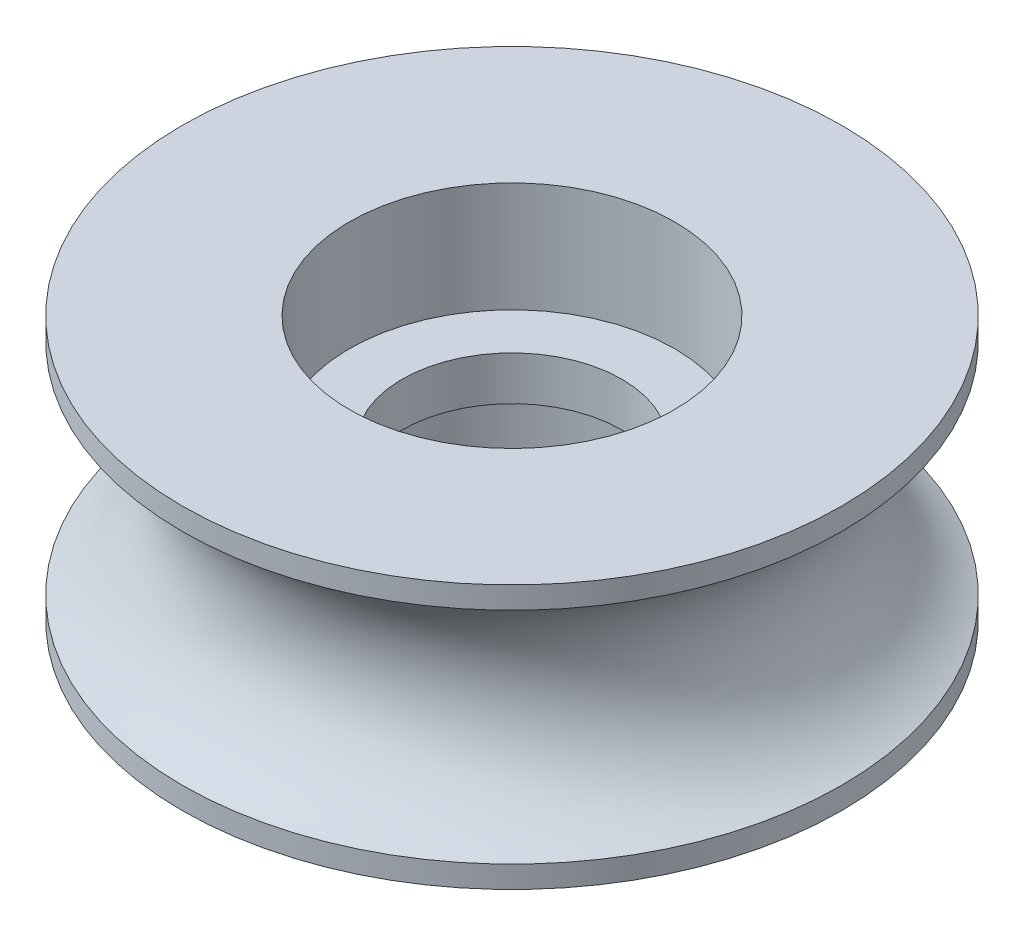
ISO-10303-21;
HEADER;
FILE_DESCRIPTION(('STEP AP214'),'2;1');
FILE_NAME('part.step','',(''),(''),'','','');
FILE_SCHEMA(('AUTOMOTIVE_DESIGN { 1 0 10303 214 1 1 1 1 }'));
ENDSEC;
DATA;
#1=APPLICATION_CONTEXT('core data for automotive mechanical design processes');
#2=APPLICATION_PROTOCOL_DEFINITION('international standard','automotive_design',2000,#1);
#3=PRODUCT_CONTEXT('',#1,'mechanical');
#4=PRODUCT('Part','Part','',(#3));
#5=PRODUCT_RELATED_PRODUCT_CATEGORY('part','',(#4));
#6=PRODUCT_DEFINITION_FORMATION('','',#4);
#7=PRODUCT_DEFINITION_CONTEXT('part definition',#1,'design');
#8=PRODUCT_DEFINITION('design','',#6,#7);
#9=PRODUCT_DEFINITION_SHAPE('','',#8);
#10=(LENGTH_UNIT() NAMED_UNIT(*) SI_UNIT(.MILLI.,.METRE.));
#11=(NAMED_UNIT(*) PLANE_ANGLE_UNIT() SI_UNIT($,.RADIAN.));
#12=(NAMED_UNIT(*) SI_UNIT($,.STERADIAN.) SOLID_ANGLE_UNIT());
#13=UNCERTAINTY_MEASURE_WITH_UNIT(LENGTH_MEASURE(1.E-05),#10,'distance_accuracy_value','');
#14=(GEOMETRIC_REPRESENTATION_CONTEXT(3) GLOBAL_UNCERTAINTY_ASSIGNED_CONTEXT((#13)) GLOBAL_UNIT_ASSIGNED_CONTEXT((#10,
#11,#12)) REPRESENTATION_CONTEXT('',''));
#15=CARTESIAN_POINT('',(0.,0.,0.));
#16=DIRECTION('',(0.,0.,1.));
#17=DIRECTION('',(1.,0.,0.));
#18=AXIS2_PLACEMENT_3D('',#15,#16,#17);
#19=CARTESIAN_POINT('',(0.,-6.62953088122321,0.));
#20=DIRECTION('',(0.,-1.,0.));
#21=DIRECTION('',(0.,0.,-1.));
#22=AXIS2_PLACEMENT_3D('',#19,#20,#21);
#23=CYLINDRICAL_SURFACE('',#22,7.5);
#24=CARTESIAN_POINT('',(0.,0.,0.));
#25=DIRECTION('',(0.,-1.,0.));
#26=DIRECTION('',(0.,0.,-1.));
#27=AXIS2_PLACEMENT_3D('',#24,#25,#26);
#28=CIRCLE('',#27,7.5);
#29=CARTESIAN_POINT('',(0.,0.,-7.5));
#30=VERTEX_POINT('',#29);
#31=EDGE_CURVE('E65',#30,#30,#28,.T.);
#32=ORIENTED_EDGE('',*,*,#31,.F.);
#33=EDGE_LOOP('',(#32));
#34=FACE_BOUND('',#33,.T.);
#35=CARTESIAN_POINT('',(0.,0.5,0.));
#36=DIRECTION('',(0.,-1.,0.));
#37=DIRECTION('',(0.,0.,-1.));
#38=AXIS2_PLACEMENT_3D('',#35,#36,#37);
#39=CIRCLE('',#38,7.5);
#40=CARTESIAN_POINT('',(0.,0.5,-7.5));
#41=VERTEX_POINT('',#40);
#42=EDGE_CURVE('E10',#41,#41,#39,.T.);
#43=ORIENTED_EDGE('',*,*,#42,.T.);
#44=EDGE_LOOP('',(#43));
#45=FACE_BOUND('',#44,.T.);
#46=ADVANCED_FACE('F31',(#34,#45),#23,.T.);
#47=CARTESIAN_POINT('',(0.,3.,0.));
#48=DIRECTION('',(0.,-1.,0.));
#49=DIRECTION('',(0.,0.,-1.));
#50=AXIS2_PLACEMENT_3D('',#47,#48,#49);
#51=TOROIDAL_SURFACE('',#50,8.51980390271856,2.7);
#52=ORIENTED_EDGE('',*,*,#42,.F.);
#53=EDGE_LOOP('',(#52));
#54=FACE_BOUND('',#53,.T.);
#55=CARTESIAN_POINT('',(0.,5.5,0.));
#56=DIRECTION('',(0.,-1.,0.));
#57=DIRECTION('',(0.,0.,-1.));
#58=AXIS2_PLACEMENT_3D('',#55,#56,#57);
#59=CIRCLE('',#58,7.5);
#60=CARTESIAN_POINT('',(0.,5.5,-7.5));
#61=VERTEX_POINT('',#60);
#62=EDGE_CURVE('E37',#61,#61,#59,.T.);
#63=ORIENTED_EDGE('',*,*,#62,.T.);
#64=EDGE_LOOP('',(#63));
#65=FACE_BOUND('',#64,.T.);
#66=ADVANCED_FACE('F72',(#54,#65),#51,.F.);
#67=CARTESIAN_POINT('',(0.,-6.62953088122321,0.));
#68=DIRECTION('',(0.,-1.,0.));
#69=DIRECTION('',(0.,0.,-1.));
#70=AXIS2_PLACEMENT_3D('',#67,#68,#69);
#71=CYLINDRICAL_SURFACE('',#70,7.5);
#72=ORIENTED_EDGE('',*,*,#62,.F.);
#73=EDGE_LOOP('',(#72));
#74=FACE_BOUND('',#73,.T.);
#75=CARTESIAN_POINT('',(0.,6.,0.));
#76=DIRECTION('',(0.,-1.,0.));
#77=DIRECTION('',(0.,0.,-1.));
#78=AXIS2_PLACEMENT_3D('',#75,#76,#77);
#79=CIRCLE('',#78,7.5);
#80=CARTESIAN_POINT('',(0.,6.,-7.5));
#81=VERTEX_POINT('',#80);
#82=EDGE_CURVE('E41',#81,#81,#79,.T.);
#83=ORIENTED_EDGE('',*,*,#82,.T.);
#84=EDGE_LOOP('',(#83));
#85=FACE_BOUND('',#84,.T.);
#86=ADVANCED_FACE('F76',(#74,#85),#71,.T.);
#87=CARTESIAN_POINT('',(-7.5,6.,0.));
#88=DIRECTION('',(0.,-1.,0.));
#89=DIRECTION('',(0.,0.,-1.));
#90=AXIS2_PLACEMENT_3D('',#87,#88,#89);
#91=PLANE('',#90);
#92=ORIENTED_EDGE('',*,*,#82,.F.);
#93=EDGE_LOOP('',(#92));
#94=FACE_BOUND('',#93,.T.);
#95=CARTESIAN_POINT('',(0.,6.,0.));
#96=DIRECTION('',(0.,-1.,0.));
#97=DIRECTION('',(0.,0.,-1.));
#98=AXIS2_PLACEMENT_3D('',#95,#96,#97);
#99=CIRCLE('',#98,3.7);
#100=CARTESIAN_POINT('',(0.,6.,-3.7));
#101=VERTEX_POINT('',#100);
#102=EDGE_CURVE('E45',#101,#101,#99,.T.);
#103=ORIENTED_EDGE('',*,*,#102,.T.);
#104=EDGE_LOOP('',(#103));
#105=FACE_BOUND('',#104,.T.);
#106=ADVANCED_FACE('F81',(#94,#105),#91,.F.);
#107=CARTESIAN_POINT('',(0.,-6.62953088122321,0.));
#108=DIRECTION('',(0.,-1.,0.));
#109=DIRECTION('',(0.,0.,-1.));
#110=AXIS2_PLACEMENT_3D('',#107,#108,#109);
#111=CYLINDRICAL_SURFACE('',#110,3.7);
#112=ORIENTED_EDGE('',*,*,#102,.F.);
#113=EDGE_LOOP('',(#112));
#114=FACE_BOUND('',#113,.T.);
#115=CARTESIAN_POINT('',(0.,3.5,0.));
#116=DIRECTION('',(0.,-1.,0.));
#117=DIRECTION('',(0.,0.,-1.));
#118=AXIS2_PLACEMENT_3D('',#115,#116,#117);
#119=CIRCLE('',#118,3.7);
#120=CARTESIAN_POINT('',(0.,3.5,-3.7));
#121=VERTEX_POINT('',#120);
#122=EDGE_CURVE('E50',#121,#121,#119,.T.);
#123=ORIENTED_EDGE('',*,*,#122,.T.);
#124=EDGE_LOOP('',(#123));
#125=FACE_BOUND('',#124,.T.);
#126=ADVANCED_FACE('F87',(#114,#125),#111,.F.);
#127=CARTESIAN_POINT('',(-2.5,3.5,0.));
#128=DIRECTION('',(0.,-1.,0.));
#129=DIRECTION('',(0.,0.,-1.));
#130=AXIS2_PLACEMENT_3D('',#127,#128,#129);
#131=PLANE('',#130);
#132=ORIENTED_EDGE('',*,*,#122,.F.);
#133=EDGE_LOOP('',(#132));
#134=FACE_BOUND('',#133,.T.);
#135=CARTESIAN_POINT('',(0.,3.5,0.));
#136=DIRECTION('',(0.,-1.,0.));
#137=DIRECTION('',(0.,0.,-1.));
#138=AXIS2_PLACEMENT_3D('',#135,#136,#137);
#139=CIRCLE('',#138,2.5);
#140=CARTESIAN_POINT('',(0.,3.5,-2.5));
#141=VERTEX_POINT('',#140);
#142=EDGE_CURVE('E53',#141,#141,#139,.T.);
#143=ORIENTED_EDGE('',*,*,#142,.T.);
#144=EDGE_LOOP('',(#143));
#145=FACE_BOUND('',#144,.T.);
#146=ADVANCED_FACE('F91',(#134,#145),#131,.F.);
#147=CARTESIAN_POINT('',(0.,-6.62953088122321,0.));
#148=DIRECTION('',(0.,-1.,0.));
#149=DIRECTION('',(0.,0.,-1.));
#150=AXIS2_PLACEMENT_3D('',#147,#148,#149);
#151=CYLINDRICAL_SURFACE('',#150,2.5);
#152=ORIENTED_EDGE('',*,*,#142,.F.);
#153=EDGE_LOOP('',(#152));
#154=FACE_BOUND('',#153,.T.);
#155=CARTESIAN_POINT('',(0.,2.5,0.));
#156=DIRECTION('',(0.,-1.,0.));
#157=DIRECTION('',(0.,0.,-1.));
#158=AXIS2_PLACEMENT_3D('',#155,#156,#157);
#159=CIRCLE('',#158,2.5);
#160=CARTESIAN_POINT('',(0.,2.5,-2.5));
#161=VERTEX_POINT('',#160);
#162=EDGE_CURVE('E56',#161,#161,#159,.T.);
#163=ORIENTED_EDGE('',*,*,#162,.T.);
#164=EDGE_LOOP('',(#163));
#165=FACE_BOUND('',#164,.T.);
#166=ADVANCED_FACE('F95',(#154,#165),#151,.F.);
#167=CARTESIAN_POINT('',(-3.7,2.5,0.));
#168=DIRECTION('',(0.,1.,0.));
#169=DIRECTION('',(0.,0.,1.));
#170=AXIS2_PLACEMENT_3D('',#167,#168,#169);
#171=PLANE('',#170);
#172=ORIENTED_EDGE('',*,*,#162,.F.);
#173=EDGE_LOOP('',(#172));
#174=FACE_BOUND('',#173,.T.);
#175=CARTESIAN_POINT('',(0.,2.5,0.));
#176=DIRECTION('',(0.,-1.,0.));
#177=DIRECTION('',(0.,0.,-1.));
#178=AXIS2_PLACEMENT_3D('',#175,#176,#177);
#179=CIRCLE('',#178,3.7);
#180=CARTESIAN_POINT('',(0.,2.5,-3.7));
#181=VERTEX_POINT('',#180);
#182=EDGE_CURVE('E59',#181,#181,#179,.T.);
#183=ORIENTED_EDGE('',*,*,#182,.T.);
#184=EDGE_LOOP('',(#183));
#185=FACE_BOUND('',#184,.T.);
#186=ADVANCED_FACE('F99',(#174,#185),#171,.F.);
#187=CARTESIAN_POINT('',(0.,-6.62953088122321,0.));
#188=DIRECTION('',(0.,-1.,0.));
#189=DIRECTION('',(0.,0.,-1.));
#190=AXIS2_PLACEMENT_3D('',#187,#188,#189);
#191=CYLINDRICAL_SURFACE('',#190,3.7);
#192=ORIENTED_EDGE('',*,*,#182,.F.);
#193=EDGE_LOOP('',(#192));
#194=FACE_BOUND('',#193,.T.);
#195=CARTESIAN_POINT('',(0.,0.,0.));
#196=DIRECTION('',(0.,-1.,0.));
#197=DIRECTION('',(0.,0.,-1.));
#198=AXIS2_PLACEMENT_3D('',#195,#196,#197);
#199=CIRCLE('',#198,3.7);
#200=CARTESIAN_POINT('',(0.,0.,-3.7));
#201=VERTEX_POINT('',#200);
#202=EDGE_CURVE('E62',#201,#201,#199,.T.);
#203=ORIENTED_EDGE('',*,*,#202,.T.);
#204=EDGE_LOOP('',(#203));
#205=FACE_BOUND('',#204,.T.);
#206=ADVANCED_FACE('F103',(#194,#205),#191,.F.);
#207=CARTESIAN_POINT('',(-3.7,0.,0.));
#208=DIRECTION('',(0.,1.,0.));
#209=DIRECTION('',(0.,0.,1.));
#210=AXIS2_PLACEMENT_3D('',#207,#208,#209);
#211=PLANE('',#210);
#212=ORIENTED_EDGE('',*,*,#202,.F.);
#213=EDGE_LOOP('',(#212));
#214=FACE_BOUND('',#213,.T.);
#215=ORIENTED_EDGE('',*,*,#31,.T.);
#216=EDGE_LOOP('',(#215));
#217=FACE_BOUND('',#216,.T.);
#218=ADVANCED_FACE('F69',(#214,#217),#211,.F.);
#219=CLOSED_SHELL('',(#46,#66,#86,#106,#126,#146,#166,#186,#206,#218));
#220=MANIFOLD_SOLID_BREP('B2',#219);
#221=ADVANCED_BREP_SHAPE_REPRESENTATION('',(#18,#220),#14);
#222=SHAPE_DEFINITION_REPRESENTATION(#9,#221);
ENDSEC;
END-ISO-10303-21;
